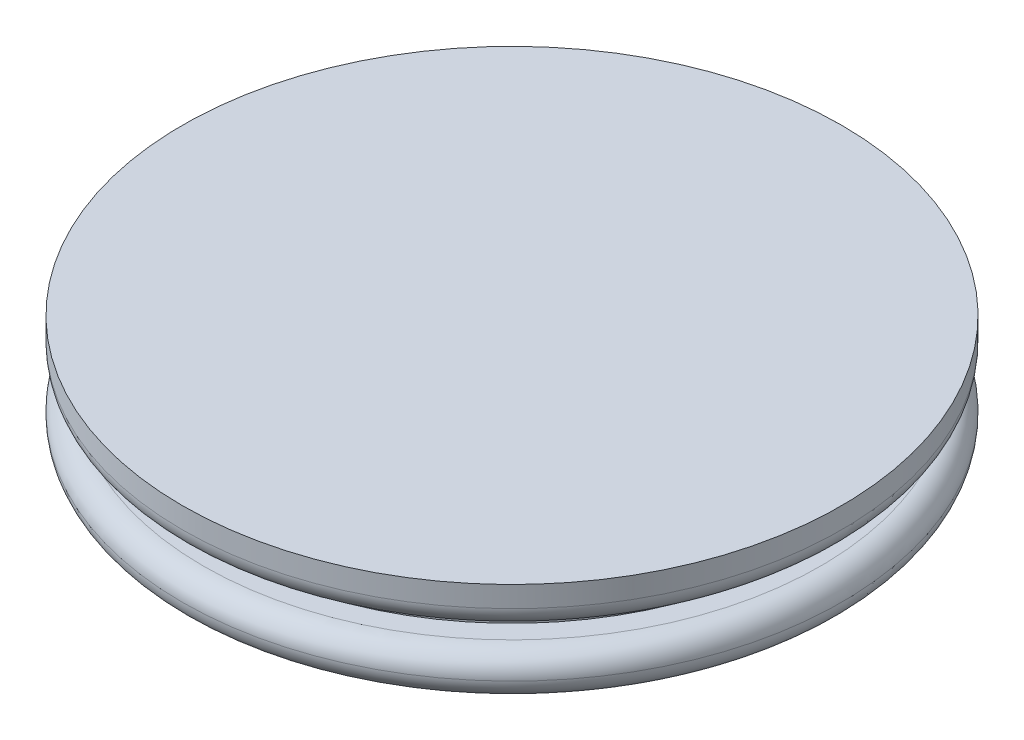
ISO-10303-21;
HEADER;
FILE_DESCRIPTION(('STEP AP214'),'2;1');
FILE_NAME('part.step','',(''),(''),'','','');
FILE_SCHEMA(('AUTOMOTIVE_DESIGN { 1 0 10303 214 1 1 1 1 }'));
ENDSEC;
DATA;
#1=APPLICATION_CONTEXT('core data for automotive mechanical design processes');
#2=APPLICATION_PROTOCOL_DEFINITION('international standard','automotive_design',2000,#1);
#3=PRODUCT_CONTEXT('',#1,'mechanical');
#4=PRODUCT('Part','Part','',(#3));
#5=PRODUCT_RELATED_PRODUCT_CATEGORY('part','',(#4));
#6=PRODUCT_DEFINITION_FORMATION('','',#4);
#7=PRODUCT_DEFINITION_CONTEXT('part definition',#1,'design');
#8=PRODUCT_DEFINITION('design','',#6,#7);
#9=PRODUCT_DEFINITION_SHAPE('','',#8);
#10=(LENGTH_UNIT() NAMED_UNIT(*) SI_UNIT(.MILLI.,.METRE.));
#11=(NAMED_UNIT(*) PLANE_ANGLE_UNIT() SI_UNIT($,.RADIAN.));
#12=(NAMED_UNIT(*) SI_UNIT($,.STERADIAN.) SOLID_ANGLE_UNIT());
#13=UNCERTAINTY_MEASURE_WITH_UNIT(LENGTH_MEASURE(1.E-05),#10,'distance_accuracy_value','');
#14=(GEOMETRIC_REPRESENTATION_CONTEXT(3) GLOBAL_UNCERTAINTY_ASSIGNED_CONTEXT((#13)) GLOBAL_UNIT_ASSIGNED_CONTEXT((#10,
#11,#12)) REPRESENTATION_CONTEXT('',''));
#15=CARTESIAN_POINT('',(0.,0.,0.));
#16=DIRECTION('',(0.,0.,1.));
#17=DIRECTION('',(1.,0.,0.));
#18=AXIS2_PLACEMENT_3D('',#15,#16,#17);
#19=CARTESIAN_POINT('',(0.,2.54,0.));
#20=DIRECTION('',(0.,1.,0.));
#21=DIRECTION('',(0.,0.,1.));
#22=AXIS2_PLACEMENT_3D('',#19,#20,#21);
#23=PLANE('',#22);
#24=CARTESIAN_POINT('',(0.,2.54,0.));
#25=DIRECTION('',(0.,1.,0.));
#26=DIRECTION('',(0.,0.,1.));
#27=AXIS2_PLACEMENT_3D('',#24,#25,#26);
#28=CIRCLE('',#27,18.73);
#29=CARTESIAN_POINT('',(0.,2.54,18.73));
#30=VERTEX_POINT('',#29);
#31=EDGE_CURVE('E10',#30,#30,#28,.T.);
#32=ORIENTED_EDGE('',*,*,#31,.T.);
#33=EDGE_LOOP('',(#32));
#34=FACE_BOUND('',#33,.T.);
#35=CARTESIAN_POINT('',(0.,2.54,0.));
#36=DIRECTION('',(0.,1.,0.));
#37=DIRECTION('',(0.,0.,1.));
#38=AXIS2_PLACEMENT_3D('',#35,#36,#37);
#39=CIRCLE('',#38,17.5);
#40=CARTESIAN_POINT('',(0.,2.54,17.5));
#41=VERTEX_POINT('',#40);
#42=EDGE_CURVE('E51',#41,#41,#39,.T.);
#43=ORIENTED_EDGE('',*,*,#42,.F.);
#44=EDGE_LOOP('',(#43));
#45=FACE_BOUND('',#44,.T.);
#46=ADVANCED_FACE('F31',(#34,#45),#23,.T.);
#47=CARTESIAN_POINT('',(0.,0.,0.));
#48=DIRECTION('',(0.,1.,0.));
#49=DIRECTION('',(0.,0.,1.));
#50=AXIS2_PLACEMENT_3D('',#47,#48,#49);
#51=PLANE('',#50);
#52=CARTESIAN_POINT('',(0.,0.,0.));
#53=DIRECTION('',(0.,1.,0.));
#54=DIRECTION('',(0.,0.,1.));
#55=AXIS2_PLACEMENT_3D('',#52,#53,#54);
#56=CIRCLE('',#55,18.73);
#57=CARTESIAN_POINT('',(0.,0.,18.73));
#58=VERTEX_POINT('',#57);
#59=EDGE_CURVE('E39',#58,#58,#56,.F.);
#60=ORIENTED_EDGE('',*,*,#59,.T.);
#61=EDGE_LOOP('',(#60));
#62=FACE_BOUND('',#61,.T.);
#63=ADVANCED_FACE('F78',(#62),#51,.F.);
#64=CARTESIAN_POINT('',(0.,3.81,0.));
#65=DIRECTION('',(0.,-1.,0.));
#66=DIRECTION('',(0.,0.,-1.));
#67=AXIS2_PLACEMENT_3D('',#64,#65,#66);
#68=CYLINDRICAL_SURFACE('',#67,17.5);
#69=CARTESIAN_POINT('',(0.,3.81,0.));
#70=DIRECTION('',(0.,1.,0.));
#71=DIRECTION('',(0.,0.,1.));
#72=AXIS2_PLACEMENT_3D('',#69,#70,#71);
#73=CIRCLE('',#72,17.5);
#74=CARTESIAN_POINT('',(0.,3.81,17.5));
#75=VERTEX_POINT('',#74);
#76=EDGE_CURVE('E54',#75,#75,#73,.T.);
#77=ORIENTED_EDGE('',*,*,#76,.F.);
#78=EDGE_LOOP('',(#77));
#79=FACE_BOUND('',#78,.T.);
#80=ORIENTED_EDGE('',*,*,#42,.T.);
#81=EDGE_LOOP('',(#80));
#82=FACE_BOUND('',#81,.T.);
#83=ADVANCED_FACE('F83',(#79,#82),#68,.T.);
#84=CARTESIAN_POINT('',(0.,6.35,0.));
#85=DIRECTION('',(0.,-1.,0.));
#86=DIRECTION('',(0.,0.,-1.));
#87=AXIS2_PLACEMENT_3D('',#84,#85,#86);
#88=CYLINDRICAL_SURFACE('',#87,20.);
#89=CARTESIAN_POINT('',(0.,5.08,0.));
#90=DIRECTION('',(0.,1.,0.));
#91=DIRECTION('',(0.,0.,1.));
#92=AXIS2_PLACEMENT_3D('',#89,#90,#91);
#93=CIRCLE('',#92,20.);
#94=CARTESIAN_POINT('',(0.,5.08,20.));
#95=VERTEX_POINT('',#94);
#96=EDGE_CURVE('E48',#95,#95,#93,.T.);
#97=ORIENTED_EDGE('',*,*,#96,.T.);
#98=EDGE_LOOP('',(#97));
#99=FACE_BOUND('',#98,.T.);
#100=CARTESIAN_POINT('',(0.,6.35,0.));
#101=DIRECTION('',(0.,1.,0.));
#102=DIRECTION('',(0.,0.,1.));
#103=AXIS2_PLACEMENT_3D('',#100,#101,#102);
#104=CIRCLE('',#103,20.);
#105=CARTESIAN_POINT('',(0.,6.35,20.));
#106=VERTEX_POINT('',#105);
#107=EDGE_CURVE('E57',#106,#106,#104,.T.);
#108=ORIENTED_EDGE('',*,*,#107,.F.);
#109=EDGE_LOOP('',(#108));
#110=FACE_BOUND('',#109,.T.);
#111=ADVANCED_FACE('F90',(#99,#110),#88,.T.);
#112=CARTESIAN_POINT('',(0.,6.35,0.));
#113=DIRECTION('',(0.,1.,0.));
#114=DIRECTION('',(0.,0.,1.));
#115=AXIS2_PLACEMENT_3D('',#112,#113,#114);
#116=PLANE('',#115);
#117=ORIENTED_EDGE('',*,*,#107,.T.);
#118=EDGE_LOOP('',(#117));
#119=FACE_BOUND('',#118,.T.);
#120=ADVANCED_FACE('F94',(#119),#116,.T.);
#121=CARTESIAN_POINT('',(0.,3.81,0.));
#122=DIRECTION('',(0.,1.,0.));
#123=DIRECTION('',(0.,0.,1.));
#124=AXIS2_PLACEMENT_3D('',#121,#122,#123);
#125=PLANE('',#124);
#126=CARTESIAN_POINT('',(0.,3.81,0.));
#127=DIRECTION('',(0.,1.,0.));
#128=DIRECTION('',(0.,0.,1.));
#129=AXIS2_PLACEMENT_3D('',#126,#127,#128);
#130=CIRCLE('',#129,18.73);
#131=CARTESIAN_POINT('',(0.,3.81,18.73));
#132=VERTEX_POINT('',#131);
#133=EDGE_CURVE('E43',#132,#132,#130,.F.);
#134=ORIENTED_EDGE('',*,*,#133,.T.);
#135=EDGE_LOOP('',(#134));
#136=FACE_BOUND('',#135,.T.);
#137=ORIENTED_EDGE('',*,*,#76,.T.);
#138=EDGE_LOOP('',(#137));
#139=FACE_BOUND('',#138,.T.);
#140=ADVANCED_FACE('F74',(#136,#139),#125,.F.);
#141=CARTESIAN_POINT('',(0.,5.08,0.));
#142=DIRECTION('',(0.,1.,0.));
#143=DIRECTION('',(0.,0.,1.));
#144=AXIS2_PLACEMENT_3D('',#141,#142,#143);
#145=TOROIDAL_SURFACE('',#144,18.73,1.27);
#146=ORIENTED_EDGE('',*,*,#133,.F.);
#147=EDGE_LOOP('',(#146));
#148=FACE_BOUND('',#147,.T.);
#149=ORIENTED_EDGE('',*,*,#96,.F.);
#150=EDGE_LOOP('',(#149));
#151=FACE_BOUND('',#150,.T.);
#152=ADVANCED_FACE('F67',(#148,#151),#145,.T.);
#153=CARTESIAN_POINT('',(0.,1.27,0.));
#154=DIRECTION('',(0.,1.,0.));
#155=DIRECTION('',(0.,0.,1.));
#156=AXIS2_PLACEMENT_3D('',#153,#154,#155);
#157=TOROIDAL_SURFACE('',#156,18.73,1.27);
#158=ORIENTED_EDGE('',*,*,#31,.F.);
#159=EDGE_LOOP('',(#158));
#160=FACE_BOUND('',#159,.T.);
#161=CARTESIAN_POINT('',(0.,1.27,0.));
#162=DIRECTION('',(0.,1.,0.));
#163=DIRECTION('',(0.,0.,1.));
#164=AXIS2_PLACEMENT_3D('',#161,#162,#163);
#165=CIRCLE('',#164,20.);
#166=CARTESIAN_POINT('',(0.,1.27,20.));
#167=VERTEX_POINT('',#166);
#168=EDGE_CURVE('E35',#167,#167,#165,.F.);
#169=ORIENTED_EDGE('',*,*,#168,.F.);
#170=EDGE_LOOP('',(#169));
#171=FACE_BOUND('',#170,.T.);
#172=ADVANCED_FACE('F33',(#160,#171),#157,.T.);
#173=CARTESIAN_POINT('',(0.,1.27,0.));
#174=DIRECTION('',(0.,1.,0.));
#175=DIRECTION('',(0.,0.,1.));
#176=AXIS2_PLACEMENT_3D('',#173,#174,#175);
#177=TOROIDAL_SURFACE('',#176,18.73,1.27);
#178=ORIENTED_EDGE('',*,*,#59,.F.);
#179=EDGE_LOOP('',(#178));
#180=FACE_BOUND('',#179,.T.);
#181=ORIENTED_EDGE('',*,*,#168,.T.);
#182=EDGE_LOOP('',(#181));
#183=FACE_BOUND('',#182,.T.);
#184=ADVANCED_FACE('F64',(#180,#183),#177,.T.);
#185=CLOSED_SHELL('',(#46,#63,#83,#111,#120,#140,#152,#172,#184));
#186=MANIFOLD_SOLID_BREP('B2',#185);
#187=ADVANCED_BREP_SHAPE_REPRESENTATION('',(#18,#186),#14);
#188=SHAPE_DEFINITION_REPRESENTATION(#9,#187);
ENDSEC;
END-ISO-10303-21;
